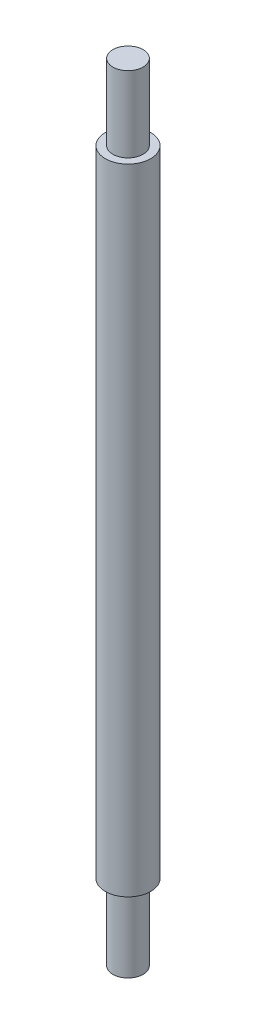
ISO-10303-21;
HEADER;
FILE_DESCRIPTION(('STEP AP214'),'2;1');
FILE_NAME('part.step','',(''),(''),'','','');
FILE_SCHEMA(('AUTOMOTIVE_DESIGN { 1 0 10303 214 1 1 1 1 }'));
ENDSEC;
DATA;
#1=APPLICATION_CONTEXT('core data for automotive mechanical design processes');
#2=APPLICATION_PROTOCOL_DEFINITION('international standard','automotive_design',2000,#1);
#3=PRODUCT_CONTEXT('',#1,'mechanical');
#4=PRODUCT('Part','Part','',(#3));
#5=PRODUCT_RELATED_PRODUCT_CATEGORY('part','',(#4));
#6=PRODUCT_DEFINITION_FORMATION('','',#4);
#7=PRODUCT_DEFINITION_CONTEXT('part definition',#1,'design');
#8=PRODUCT_DEFINITION('design','',#6,#7);
#9=PRODUCT_DEFINITION_SHAPE('','',#8);
#10=(LENGTH_UNIT() NAMED_UNIT(*) SI_UNIT(.MILLI.,.METRE.));
#11=(NAMED_UNIT(*) PLANE_ANGLE_UNIT() SI_UNIT($,.RADIAN.));
#12=(NAMED_UNIT(*) SI_UNIT($,.STERADIAN.) SOLID_ANGLE_UNIT());
#13=UNCERTAINTY_MEASURE_WITH_UNIT(LENGTH_MEASURE(1.E-05),#10,'distance_accuracy_value','');
#14=(GEOMETRIC_REPRESENTATION_CONTEXT(3) GLOBAL_UNCERTAINTY_ASSIGNED_CONTEXT((#13)) GLOBAL_UNIT_ASSIGNED_CONTEXT((#10,
#11,#12)) REPRESENTATION_CONTEXT('',''));
#15=CARTESIAN_POINT('',(0.,0.,0.));
#16=DIRECTION('',(0.,0.,1.));
#17=DIRECTION('',(1.,0.,0.));
#18=AXIS2_PLACEMENT_3D('',#15,#16,#17);
#19=CARTESIAN_POINT('',(0.,94.0000000000008,2.63677968348475E-13));
#20=DIRECTION('',(0.,-1.,0.));
#21=DIRECTION('',(0.,0.,-1.));
#22=AXIS2_PLACEMENT_3D('',#19,#20,#21);
#23=CYLINDRICAL_SURFACE('',#22,3.);
#24=CARTESIAN_POINT('',(0.,94.0000000000008,2.63677968348475E-13));
#25=DIRECTION('',(0.,1.,0.));
#26=DIRECTION('',(0.,0.,1.));
#27=AXIS2_PLACEMENT_3D('',#24,#25,#26);
#28=CIRCLE('',#27,3.);
#29=CARTESIAN_POINT('',(0.,94.0000000000008,3.00000000000026));
#30=VERTEX_POINT('',#29);
#31=EDGE_CURVE('E54',#30,#30,#28,.T.);
#32=ORIENTED_EDGE('',*,*,#31,.F.);
#33=EDGE_LOOP('',(#32));
#34=FACE_BOUND('',#33,.T.);
#35=CARTESIAN_POINT('',(0.,10.,0.));
#36=DIRECTION('',(0.,1.,0.));
#37=DIRECTION('',(0.,0.,1.));
#38=AXIS2_PLACEMENT_3D('',#35,#36,#37);
#39=CIRCLE('',#38,3.);
#40=CARTESIAN_POINT('',(0.,10.,3.));
#41=VERTEX_POINT('',#40);
#42=EDGE_CURVE('E49',#41,#41,#39,.T.);
#43=ORIENTED_EDGE('',*,*,#42,.T.);
#44=EDGE_LOOP('',(#43));
#45=FACE_BOUND('',#44,.T.);
#46=ADVANCED_FACE('F46',(#34,#45),#23,.T.);
#47=CARTESIAN_POINT('',(0.,94.0000000000008,2.63677968348475E-13));
#48=DIRECTION('',(0.,1.,0.));
#49=DIRECTION('',(0.,0.,1.));
#50=AXIS2_PLACEMENT_3D('',#47,#48,#49);
#51=PLANE('',#50);
#52=CARTESIAN_POINT('',(0.,94.0000000000008,2.63677968348475E-13));
#53=DIRECTION('',(0.,1.,0.));
#54=DIRECTION('',(0.,0.,1.));
#55=AXIS2_PLACEMENT_3D('',#52,#53,#54);
#56=CIRCLE('',#55,2.);
#57=CARTESIAN_POINT('',(0.,94.0000000000008,2.00000000000026));
#58=VERTEX_POINT('',#57);
#59=EDGE_CURVE('E11',#58,#58,#56,.T.);
#60=ORIENTED_EDGE('',*,*,#59,.F.);
#61=EDGE_LOOP('',(#60));
#62=FACE_BOUND('',#61,.T.);
#63=ORIENTED_EDGE('',*,*,#31,.T.);
#64=EDGE_LOOP('',(#63));
#65=FACE_BOUND('',#64,.T.);
#66=ADVANCED_FACE('F77',(#62,#65),#51,.T.);
#67=CARTESIAN_POINT('',(0.,10.,0.));
#68=DIRECTION('',(0.,1.,0.));
#69=DIRECTION('',(0.,0.,1.));
#70=AXIS2_PLACEMENT_3D('',#67,#68,#69);
#71=PLANE('',#70);
#72=ORIENTED_EDGE('',*,*,#42,.F.);
#73=EDGE_LOOP('',(#72));
#74=FACE_BOUND('',#73,.T.);
#75=ADVANCED_FACE('F74',(#74),#71,.F.);
#76=CARTESIAN_POINT('',(0.,104.000000000001,0.));
#77=DIRECTION('',(0.,-1.,0.));
#78=DIRECTION('',(0.,0.,-1.));
#79=AXIS2_PLACEMENT_3D('',#76,#77,#78);
#80=CYLINDRICAL_SURFACE('',#79,2.);
#81=CARTESIAN_POINT('',(0.,104.000000000001,0.));
#82=DIRECTION('',(0.,1.,0.));
#83=DIRECTION('',(0.,0.,1.));
#84=AXIS2_PLACEMENT_3D('',#81,#82,#83);
#85=CIRCLE('',#84,2.);
#86=CARTESIAN_POINT('',(0.,104.000000000001,2.));
#87=VERTEX_POINT('',#86);
#88=EDGE_CURVE('E62',#87,#87,#85,.T.);
#89=ORIENTED_EDGE('',*,*,#88,.F.);
#90=EDGE_LOOP('',(#89));
#91=FACE_BOUND('',#90,.T.);
#92=ORIENTED_EDGE('',*,*,#59,.T.);
#93=EDGE_LOOP('',(#92));
#94=FACE_BOUND('',#93,.T.);
#95=ADVANCED_FACE('F76',(#91,#94),#80,.T.);
#96=CARTESIAN_POINT('',(0.,104.000000000001,0.));
#97=DIRECTION('',(0.,1.,0.));
#98=DIRECTION('',(0.,0.,1.));
#99=AXIS2_PLACEMENT_3D('',#96,#97,#98);
#100=PLANE('',#99);
#101=ORIENTED_EDGE('',*,*,#88,.T.);
#102=EDGE_LOOP('',(#101));
#103=FACE_BOUND('',#102,.T.);
#104=ADVANCED_FACE('F82',(#103),#100,.T.);
#105=CLOSED_SHELL('',(#46,#66,#75,#95,#104));
#106=MANIFOLD_SOLID_BREP('B2',#105);
#107=CARTESIAN_POINT('',(0.,10.,0.));
#108=DIRECTION('',(0.,-1.,0.));
#109=DIRECTION('',(0.,0.,-1.));
#110=AXIS2_PLACEMENT_3D('',#107,#108,#109);
#111=CYLINDRICAL_SURFACE('',#110,2.);
#112=CARTESIAN_POINT('',(0.,10.,0.));
#113=DIRECTION('',(0.,1.,0.));
#114=DIRECTION('',(0.,0.,1.));
#115=AXIS2_PLACEMENT_3D('',#112,#113,#114);
#116=CIRCLE('',#115,2.);
#117=CARTESIAN_POINT('',(0.,10.,2.));
#118=VERTEX_POINT('',#117);
#119=EDGE_CURVE('E45',#118,#118,#116,.T.);
#120=ORIENTED_EDGE('',*,*,#119,.F.);
#121=EDGE_LOOP('',(#120));
#122=FACE_BOUND('',#121,.T.);
#123=CARTESIAN_POINT('',(0.,0.,0.));
#124=DIRECTION('',(0.,1.,0.));
#125=DIRECTION('',(0.,0.,1.));
#126=AXIS2_PLACEMENT_3D('',#123,#124,#125);
#127=CIRCLE('',#126,2.);
#128=CARTESIAN_POINT('',(0.,0.,2.));
#129=VERTEX_POINT('',#128);
#130=EDGE_CURVE('E127',#129,#129,#127,.T.);
#131=ORIENTED_EDGE('',*,*,#130,.T.);
#132=EDGE_LOOP('',(#131));
#133=FACE_BOUND('',#132,.T.);
#134=ADVANCED_FACE('F124',(#122,#133),#111,.T.);
#135=CARTESIAN_POINT('',(0.,10.,0.));
#136=DIRECTION('',(0.,1.,0.));
#137=DIRECTION('',(0.,0.,1.));
#138=AXIS2_PLACEMENT_3D('',#135,#136,#137);
#139=PLANE('',#138);
#140=ORIENTED_EDGE('',*,*,#119,.T.);
#141=EDGE_LOOP('',(#140));
#142=FACE_BOUND('',#141,.T.);
#143=ADVANCED_FACE('F143',(#142),#139,.T.);
#144=CARTESIAN_POINT('',(0.,0.,0.));
#145=DIRECTION('',(0.,1.,0.));
#146=DIRECTION('',(0.,0.,1.));
#147=AXIS2_PLACEMENT_3D('',#144,#145,#146);
#148=PLANE('',#147);
#149=ORIENTED_EDGE('',*,*,#130,.F.);
#150=EDGE_LOOP('',(#149));
#151=FACE_BOUND('',#150,.T.);
#152=ADVANCED_FACE('F141',(#151),#148,.F.);
#153=CLOSED_SHELL('',(#134,#143,#152));
#154=MANIFOLD_SOLID_BREP('B6',#153);
#155=ADVANCED_BREP_SHAPE_REPRESENTATION('',(#18,#106,#154),#14);
#156=SHAPE_DEFINITION_REPRESENTATION(#9,#155);
ENDSEC;
END-ISO-10303-21;
